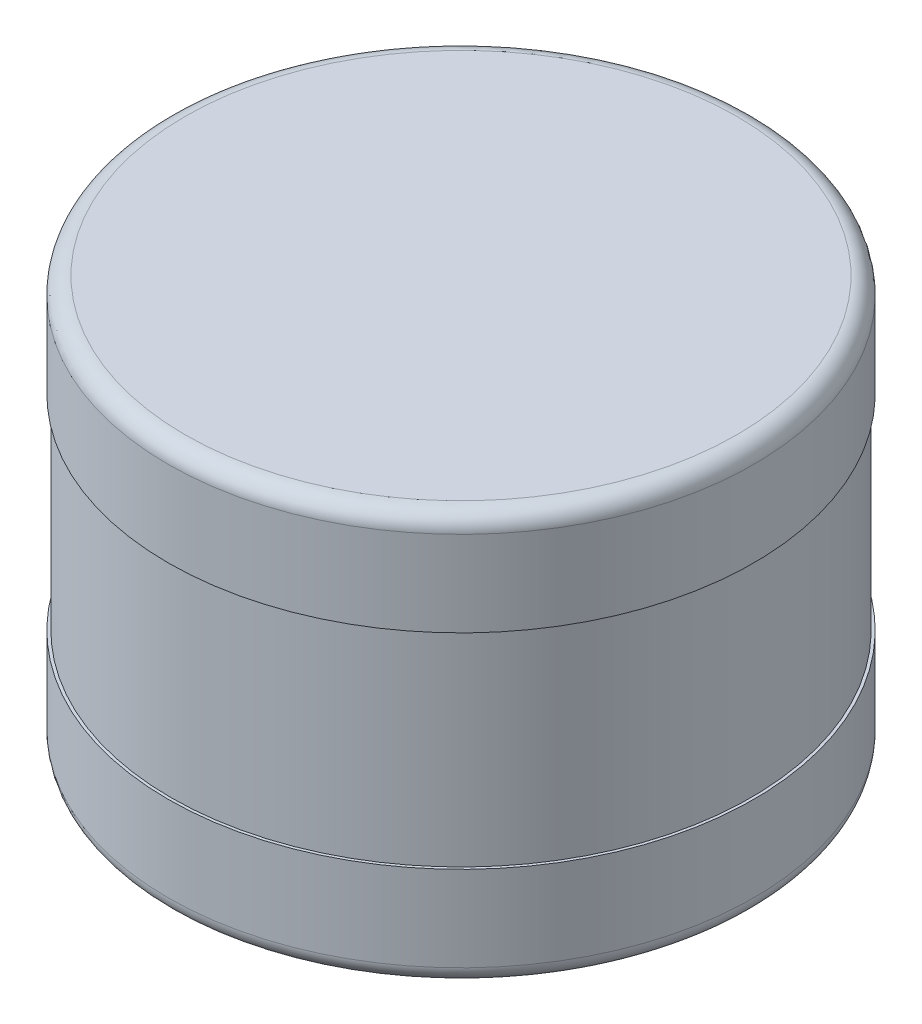
ISO-10303-21;
HEADER;
FILE_DESCRIPTION(('STEP AP214'),'2;1');
FILE_NAME('part.step','',(''),(''),'','','');
FILE_SCHEMA(('AUTOMOTIVE_DESIGN { 1 0 10303 214 1 1 1 1 }'));
ENDSEC;
DATA;
#1=APPLICATION_CONTEXT('core data for automotive mechanical design processes');
#2=APPLICATION_PROTOCOL_DEFINITION('international standard','automotive_design',2000,#1);
#3=PRODUCT_CONTEXT('',#1,'mechanical');
#4=PRODUCT('Part','Part','',(#3));
#5=PRODUCT_RELATED_PRODUCT_CATEGORY('part','',(#4));
#6=PRODUCT_DEFINITION_FORMATION('','',#4);
#7=PRODUCT_DEFINITION_CONTEXT('part definition',#1,'design');
#8=PRODUCT_DEFINITION('design','',#6,#7);
#9=PRODUCT_DEFINITION_SHAPE('','',#8);
#10=(LENGTH_UNIT() NAMED_UNIT(*) SI_UNIT(.MILLI.,.METRE.));
#11=(NAMED_UNIT(*) PLANE_ANGLE_UNIT() SI_UNIT($,.RADIAN.));
#12=(NAMED_UNIT(*) SI_UNIT($,.STERADIAN.) SOLID_ANGLE_UNIT());
#13=UNCERTAINTY_MEASURE_WITH_UNIT(LENGTH_MEASURE(1.E-05),#10,'distance_accuracy_value','');
#14=(GEOMETRIC_REPRESENTATION_CONTEXT(3) GLOBAL_UNCERTAINTY_ASSIGNED_CONTEXT((#13)) GLOBAL_UNIT_ASSIGNED_CONTEXT((#10,
#11,#12)) REPRESENTATION_CONTEXT('',''));
#15=CARTESIAN_POINT('',(0.,0.,0.));
#16=DIRECTION('',(0.,0.,1.));
#17=DIRECTION('',(1.,0.,0.));
#18=AXIS2_PLACEMENT_3D('',#15,#16,#17);
#19=CARTESIAN_POINT('',(0.,72.,0.));
#20=DIRECTION('',(0.,-1.,0.));
#21=DIRECTION('',(0.,0.,-1.));
#22=AXIS2_PLACEMENT_3D('',#19,#20,#21);
#23=CYLINDRICAL_SURFACE('',#22,51.5);
#24=CARTESIAN_POINT('',(0.,54.,0.));
#25=DIRECTION('',(0.,-1.,0.));
#26=DIRECTION('',(0.,0.,-1.));
#27=AXIS2_PLACEMENT_3D('',#24,#25,#26);
#28=CIRCLE('',#27,51.5);
#29=CARTESIAN_POINT('',(0.,54.,-51.5));
#30=VERTEX_POINT('',#29);
#31=EDGE_CURVE('E53',#30,#30,#28,.T.);
#32=ORIENTED_EDGE('',*,*,#31,.F.);
#33=EDGE_LOOP('',(#32));
#34=FACE_BOUND('',#33,.T.);
#35=CARTESIAN_POINT('',(0.,69.,0.));
#36=DIRECTION('',(0.,1.,0.));
#37=DIRECTION('',(0.,0.,1.));
#38=AXIS2_PLACEMENT_3D('',#35,#36,#37);
#39=CIRCLE('',#38,51.5);
#40=CARTESIAN_POINT('',(0.,69.,51.5));
#41=VERTEX_POINT('',#40);
#42=EDGE_CURVE('E48',#41,#41,#39,.F.);
#43=ORIENTED_EDGE('',*,*,#42,.T.);
#44=EDGE_LOOP('',(#43));
#45=FACE_BOUND('',#44,.T.);
#46=ADVANCED_FACE('F33',(#34,#45),#23,.T.);
#47=CARTESIAN_POINT('',(0.,72.,0.));
#48=DIRECTION('',(0.,1.,0.));
#49=DIRECTION('',(0.,0.,1.));
#50=AXIS2_PLACEMENT_3D('',#47,#48,#49);
#51=PLANE('',#50);
#52=CARTESIAN_POINT('',(0.,72.,0.));
#53=DIRECTION('',(0.,1.,0.));
#54=DIRECTION('',(0.,0.,1.));
#55=AXIS2_PLACEMENT_3D('',#52,#53,#54);
#56=CIRCLE('',#55,48.5);
#57=CARTESIAN_POINT('',(0.,72.,48.5));
#58=VERTEX_POINT('',#57);
#59=EDGE_CURVE('E10',#58,#58,#56,.T.);
#60=ORIENTED_EDGE('',*,*,#59,.T.);
#61=EDGE_LOOP('',(#60));
#62=FACE_BOUND('',#61,.T.);
#63=ADVANCED_FACE('F90',(#62),#51,.T.);
#64=CARTESIAN_POINT('',(0.,69.,0.));
#65=DIRECTION('',(0.,1.,0.));
#66=DIRECTION('',(0.,0.,1.));
#67=AXIS2_PLACEMENT_3D('',#64,#65,#66);
#68=TOROIDAL_SURFACE('',#67,48.5,3.);
#69=ORIENTED_EDGE('',*,*,#42,.F.);
#70=EDGE_LOOP('',(#69));
#71=FACE_BOUND('',#70,.T.);
#72=ORIENTED_EDGE('',*,*,#59,.F.);
#73=EDGE_LOOP('',(#72));
#74=FACE_BOUND('',#73,.T.);
#75=ADVANCED_FACE('F35',(#71,#74),#68,.T.);
#76=CARTESIAN_POINT('',(51.5,54.,0.));
#77=DIRECTION('',(0.,1.,0.));
#78=DIRECTION('',(0.,0.,1.));
#79=AXIS2_PLACEMENT_3D('',#76,#77,#78);
#80=PLANE('',#79);
#81=CARTESIAN_POINT('',(0.,54.,0.));
#82=DIRECTION('',(0.,-1.,0.));
#83=DIRECTION('',(0.,0.,-1.));
#84=AXIS2_PLACEMENT_3D('',#81,#82,#83);
#85=CIRCLE('',#84,51.);
#86=CARTESIAN_POINT('',(0.,54.,-51.));
#87=VERTEX_POINT('',#86);
#88=EDGE_CURVE('E56',#87,#87,#85,.T.);
#89=ORIENTED_EDGE('',*,*,#88,.F.);
#90=EDGE_LOOP('',(#89));
#91=FACE_BOUND('',#90,.T.);
#92=ORIENTED_EDGE('',*,*,#31,.T.);
#93=EDGE_LOOP('',(#92));
#94=FACE_BOUND('',#93,.T.);
#95=ADVANCED_FACE('F79',(#91,#94),#80,.F.);
#96=CARTESIAN_POINT('',(0.,0.,0.));
#97=DIRECTION('',(0.,-1.,0.));
#98=DIRECTION('',(0.,0.,-1.));
#99=AXIS2_PLACEMENT_3D('',#96,#97,#98);
#100=CYLINDRICAL_SURFACE('',#99,51.);
#101=CARTESIAN_POINT('',(0.,18.,0.));
#102=DIRECTION('',(0.,-1.,0.));
#103=DIRECTION('',(0.,0.,-1.));
#104=AXIS2_PLACEMENT_3D('',#101,#102,#103);
#105=CIRCLE('',#104,51.);
#106=CARTESIAN_POINT('',(0.,18.,-51.));
#107=VERTEX_POINT('',#106);
#108=EDGE_CURVE('E59',#107,#107,#105,.T.);
#109=ORIENTED_EDGE('',*,*,#108,.F.);
#110=EDGE_LOOP('',(#109));
#111=FACE_BOUND('',#110,.T.);
#112=ORIENTED_EDGE('',*,*,#88,.T.);
#113=EDGE_LOOP('',(#112));
#114=FACE_BOUND('',#113,.T.);
#115=ADVANCED_FACE('F73',(#111,#114),#100,.T.);
#116=CARTESIAN_POINT('',(51.,18.,0.));
#117=DIRECTION('',(0.,-1.,0.));
#118=DIRECTION('',(0.,0.,-1.));
#119=AXIS2_PLACEMENT_3D('',#116,#117,#118);
#120=PLANE('',#119);
#121=CARTESIAN_POINT('',(0.,18.,0.));
#122=DIRECTION('',(0.,-1.,0.));
#123=DIRECTION('',(0.,0.,-1.));
#124=AXIS2_PLACEMENT_3D('',#121,#122,#123);
#125=CIRCLE('',#124,51.5);
#126=CARTESIAN_POINT('',(0.,18.,-51.5));
#127=VERTEX_POINT('',#126);
#128=EDGE_CURVE('E62',#127,#127,#125,.T.);
#129=ORIENTED_EDGE('',*,*,#128,.F.);
#130=EDGE_LOOP('',(#129));
#131=FACE_BOUND('',#130,.T.);
#132=ORIENTED_EDGE('',*,*,#108,.T.);
#133=EDGE_LOOP('',(#132));
#134=FACE_BOUND('',#133,.T.);
#135=ADVANCED_FACE('F69',(#131,#134),#120,.F.);
#136=CARTESIAN_POINT('',(0.,0.,0.));
#137=DIRECTION('',(0.,1.,0.));
#138=DIRECTION('',(0.,0.,1.));
#139=AXIS2_PLACEMENT_3D('',#136,#137,#138);
#140=PLANE('',#139);
#141=CARTESIAN_POINT('',(0.,0.,0.));
#142=DIRECTION('',(0.,1.,0.));
#143=DIRECTION('',(0.,0.,1.));
#144=AXIS2_PLACEMENT_3D('',#141,#142,#143);
#145=CIRCLE('',#144,48.5);
#146=CARTESIAN_POINT('',(0.,0.,48.5));
#147=VERTEX_POINT('',#146);
#148=EDGE_CURVE('E40',#147,#147,#145,.F.);
#149=ORIENTED_EDGE('',*,*,#148,.T.);
#150=EDGE_LOOP('',(#149));
#151=FACE_BOUND('',#150,.T.);
#152=ADVANCED_FACE('F72',(#151),#140,.F.);
#153=CARTESIAN_POINT('',(0.,3.,0.));
#154=DIRECTION('',(0.,1.,0.));
#155=DIRECTION('',(0.,0.,1.));
#156=AXIS2_PLACEMENT_3D('',#153,#154,#155);
#157=TOROIDAL_SURFACE('',#156,48.5,3.);
#158=ORIENTED_EDGE('',*,*,#148,.F.);
#159=EDGE_LOOP('',(#158));
#160=FACE_BOUND('',#159,.T.);
#161=CARTESIAN_POINT('',(0.,3.,0.));
#162=DIRECTION('',(0.,1.,0.));
#163=DIRECTION('',(0.,0.,1.));
#164=AXIS2_PLACEMENT_3D('',#161,#162,#163);
#165=CIRCLE('',#164,51.5);
#166=CARTESIAN_POINT('',(0.,3.,51.5));
#167=VERTEX_POINT('',#166);
#168=EDGE_CURVE('E44',#167,#167,#165,.T.);
#169=ORIENTED_EDGE('',*,*,#168,.F.);
#170=EDGE_LOOP('',(#169));
#171=FACE_BOUND('',#170,.T.);
#172=ADVANCED_FACE('F104',(#160,#171),#157,.T.);
#173=ORIENTED_EDGE('',*,*,#128,.T.);
#174=EDGE_LOOP('',(#173));
#175=FACE_BOUND('',#174,.T.);
#176=ORIENTED_EDGE('',*,*,#168,.T.);
#177=EDGE_LOOP('',(#176));
#178=FACE_BOUND('',#177,.T.);
#179=ADVANCED_FACE('F66',(#175,#178),#23,.T.);
#180=CLOSED_SHELL('',(#46,#63,#75,#95,#115,#135,#152,#172,#179));
#181=MANIFOLD_SOLID_BREP('B2',#180);
#182=ADVANCED_BREP_SHAPE_REPRESENTATION('',(#18,#181),#14);
#183=SHAPE_DEFINITION_REPRESENTATION(#9,#182);
ENDSEC;
END-ISO-10303-21;
